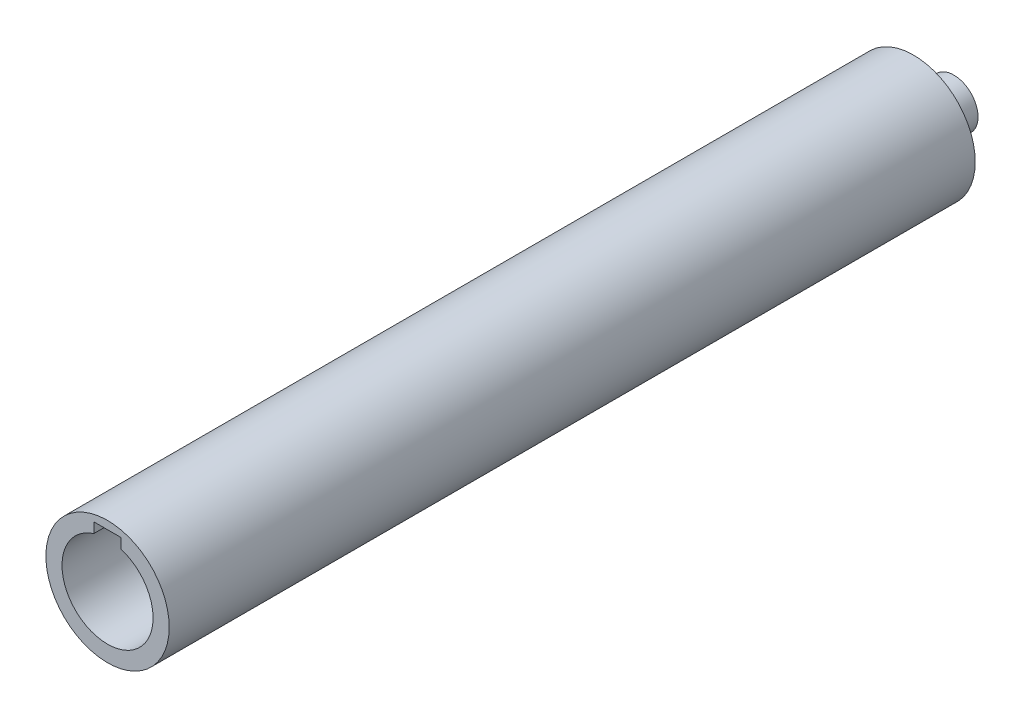
ISO-10303-21;
HEADER;
FILE_DESCRIPTION(('STEP AP214'),'2;1');
FILE_NAME('part.step','',(''),(''),'','','');
FILE_SCHEMA(('AUTOMOTIVE_DESIGN { 1 0 10303 214 1 1 1 1 }'));
ENDSEC;
DATA;
#1=APPLICATION_CONTEXT('core data for automotive mechanical design processes');
#2=APPLICATION_PROTOCOL_DEFINITION('international standard','automotive_design',2000,#1);
#3=PRODUCT_CONTEXT('',#1,'mechanical');
#4=PRODUCT('Part','Part','',(#3));
#5=PRODUCT_RELATED_PRODUCT_CATEGORY('part','',(#4));
#6=PRODUCT_DEFINITION_FORMATION('','',#4);
#7=PRODUCT_DEFINITION_CONTEXT('part definition',#1,'design');
#8=PRODUCT_DEFINITION('design','',#6,#7);
#9=PRODUCT_DEFINITION_SHAPE('','',#8);
#10=(LENGTH_UNIT() NAMED_UNIT(*) SI_UNIT(.MILLI.,.METRE.));
#11=(NAMED_UNIT(*) PLANE_ANGLE_UNIT() SI_UNIT($,.RADIAN.));
#12=(NAMED_UNIT(*) SI_UNIT($,.STERADIAN.) SOLID_ANGLE_UNIT());
#13=UNCERTAINTY_MEASURE_WITH_UNIT(LENGTH_MEASURE(1.E-05),#10,'distance_accuracy_value','');
#14=(GEOMETRIC_REPRESENTATION_CONTEXT(3) GLOBAL_UNCERTAINTY_ASSIGNED_CONTEXT((#13)) GLOBAL_UNIT_ASSIGNED_CONTEXT((#10,
#11,#12)) REPRESENTATION_CONTEXT('',''));
#15=CARTESIAN_POINT('',(0.,0.,0.));
#16=DIRECTION('',(0.,0.,1.));
#17=DIRECTION('',(1.,0.,0.));
#18=AXIS2_PLACEMENT_3D('',#15,#16,#17);
#19=CARTESIAN_POINT('',(0.,0.,-250.));
#20=DIRECTION('',(0.,0.,-1.));
#21=DIRECTION('',(1.,0.,0.));
#22=AXIS2_PLACEMENT_3D('',#19,#20,#21);
#23=PLANE('',#22);
#24=CARTESIAN_POINT('',(0.,0.,-250.));
#25=DIRECTION('',(0.,0.,1.));
#26=DIRECTION('',(1.,0.,0.));
#27=AXIS2_PLACEMENT_3D('',#24,#25,#26);
#28=CIRCLE('',#27,38.25);
#29=CARTESIAN_POINT('',(38.25,0.,-250.));
#30=VERTEX_POINT('',#29);
#31=EDGE_CURVE('E105',#30,#30,#28,.T.);
#32=ORIENTED_EDGE('',*,*,#31,.F.);
#33=EDGE_LOOP('',(#32));
#34=FACE_BOUND('',#33,.T.);
#35=CARTESIAN_POINT('',(0.,0.,-250.));
#36=DIRECTION('',(0.,0.,-1.));
#37=DIRECTION('',(-1.,0.,0.));
#38=AXIS2_PLACEMENT_3D('',#35,#36,#37);
#39=CIRCLE('',#38,15.);
#40=CARTESIAN_POINT('',(-15.,0.,-250.));
#41=VERTEX_POINT('',#40);
#42=EDGE_CURVE('E207',#41,#41,#39,.T.);
#43=ORIENTED_EDGE('',*,*,#42,.F.);
#44=EDGE_LOOP('',(#43));
#45=FACE_BOUND('',#44,.T.);
#46=ADVANCED_FACE('F34',(#34,#45),#23,.T.);
#47=CARTESIAN_POINT('',(0.,0.,250.));
#48=DIRECTION('',(0.,0.,-1.));
#49=DIRECTION('',(-1.,0.,0.));
#50=AXIS2_PLACEMENT_3D('',#47,#48,#49);
#51=CYLINDRICAL_SURFACE('',#50,38.25);
#52=CARTESIAN_POINT('',(0.,0.,250.));
#53=DIRECTION('',(0.,0.,1.));
#54=DIRECTION('',(1.,0.,0.));
#55=AXIS2_PLACEMENT_3D('',#52,#53,#54);
#56=CIRCLE('',#55,38.25);
#57=CARTESIAN_POINT('',(38.25,0.,250.));
#58=VERTEX_POINT('',#57);
#59=EDGE_CURVE('E11',#58,#58,#56,.T.);
#60=ORIENTED_EDGE('',*,*,#59,.F.);
#61=EDGE_LOOP('',(#60));
#62=FACE_BOUND('',#61,.T.);
#63=ORIENTED_EDGE('',*,*,#31,.T.);
#64=EDGE_LOOP('',(#63));
#65=FACE_BOUND('',#64,.T.);
#66=ADVANCED_FACE('F36',(#62,#65),#51,.T.);
#67=CARTESIAN_POINT('',(0.,0.,250.));
#68=DIRECTION('',(0.,0.,1.));
#69=DIRECTION('',(1.,0.,0.));
#70=AXIS2_PLACEMENT_3D('',#67,#68,#69);
#71=PLANE('',#70);
#72=CARTESIAN_POINT('',(0.,0.,250.));
#73=DIRECTION('',(0.,0.,1.));
#74=DIRECTION('',(1.,0.,0.));
#75=AXIS2_PLACEMENT_3D('',#72,#73,#74);
#76=CIRCLE('',#75,28.25);
#77=CARTESIAN_POINT('',(-8.5,26.9409075570961,250.));
#78=VERTEX_POINT('',#77);
#79=CARTESIAN_POINT('',(8.5,26.9409075570961,250.));
#80=VERTEX_POINT('',#79);
#81=EDGE_CURVE('E49',#78,#80,#76,.T.);
#82=ORIENTED_EDGE('',*,*,#81,.F.);
#83=DIRECTION('',(0.,-1.,0.));
#84=VECTOR('',#83,1.);
#85=CARTESIAN_POINT('',(-8.5,26.9409075570961,250.));
#86=LINE('',#85,#84);
#87=CARTESIAN_POINT('',(-8.5,33.25,250.));
#88=VERTEX_POINT('',#87);
#89=EDGE_CURVE('E99',#88,#78,#86,.T.);
#90=ORIENTED_EDGE('',*,*,#89,.F.);
#91=DIRECTION('',(-1.,0.,0.));
#92=VECTOR('',#91,1.);
#93=CARTESIAN_POINT('',(8.5,33.25,250.));
#94=LINE('',#93,#92);
#95=CARTESIAN_POINT('',(8.5,33.25,250.));
#96=VERTEX_POINT('',#95);
#97=EDGE_CURVE('E107',#96,#88,#94,.T.);
#98=ORIENTED_EDGE('',*,*,#97,.F.);
#99=DIRECTION('',(0.,1.,0.));
#100=VECTOR('',#99,1.);
#101=CARTESIAN_POINT('',(8.5,26.9409075570961,250.));
#102=LINE('',#101,#100);
#103=EDGE_CURVE('E83',#80,#96,#102,.T.);
#104=ORIENTED_EDGE('',*,*,#103,.F.);
#105=EDGE_LOOP('',(#82,#90,#98,#104));
#106=FACE_BOUND('',#105,.T.);
#107=ORIENTED_EDGE('',*,*,#59,.T.);
#108=EDGE_LOOP('',(#107));
#109=FACE_BOUND('',#108,.T.);
#110=ADVANCED_FACE('F112',(#106,#109),#71,.T.);
#111=CARTESIAN_POINT('',(0.,0.,200.));
#112=DIRECTION('',(0.,0.,1.));
#113=DIRECTION('',(1.,0.,0.));
#114=AXIS2_PLACEMENT_3D('',#111,#112,#113);
#115=CYLINDRICAL_SURFACE('',#114,28.25);
#116=ORIENTED_EDGE('',*,*,#81,.T.);
#117=DIRECTION('',(0.,0.,1.));
#118=VECTOR('',#117,1.);
#119=CARTESIAN_POINT('',(8.5,26.9409075570961,200.));
#120=LINE('',#119,#118);
#121=CARTESIAN_POINT('',(8.5,26.9409075570961,200.));
#122=VERTEX_POINT('',#121);
#123=EDGE_CURVE('E71',#122,#80,#120,.T.);
#124=ORIENTED_EDGE('',*,*,#123,.F.);
#125=CARTESIAN_POINT('',(0.,0.,200.));
#126=DIRECTION('',(0.,0.,1.));
#127=DIRECTION('',(1.,0.,0.));
#128=AXIS2_PLACEMENT_3D('',#125,#126,#127);
#129=CIRCLE('',#128,28.25);
#130=CARTESIAN_POINT('',(-8.5,26.9409075570961,200.));
#131=VERTEX_POINT('',#130);
#132=EDGE_CURVE('E97',#131,#122,#129,.T.);
#133=ORIENTED_EDGE('',*,*,#132,.F.);
#134=DIRECTION('',(0.,0.,1.));
#135=VECTOR('',#134,1.);
#136=CARTESIAN_POINT('',(-8.5,26.9409075570961,200.));
#137=LINE('',#136,#135);
#138=EDGE_CURVE('E42',#131,#78,#137,.T.);
#139=ORIENTED_EDGE('',*,*,#138,.T.);
#140=EDGE_LOOP('',(#116,#124,#133,#139));
#141=FACE_BOUND('',#140,.T.);
#142=ADVANCED_FACE('F117',(#141),#115,.F.);
#143=CARTESIAN_POINT('',(-8.5,26.9409075570961,200.));
#144=DIRECTION('',(-1.,0.,0.));
#145=DIRECTION('',(0.,-1.,0.));
#146=AXIS2_PLACEMENT_3D('',#143,#144,#145);
#147=PLANE('',#146);
#148=ORIENTED_EDGE('',*,*,#89,.T.);
#149=ORIENTED_EDGE('',*,*,#138,.F.);
#150=DIRECTION('',(0.,-1.,0.));
#151=VECTOR('',#150,1.);
#152=CARTESIAN_POINT('',(-8.5,26.9409075570961,200.));
#153=LINE('',#152,#151);
#154=CARTESIAN_POINT('',(-8.5,33.25,200.));
#155=VERTEX_POINT('',#154);
#156=EDGE_CURVE('E94',#155,#131,#153,.T.);
#157=ORIENTED_EDGE('',*,*,#156,.F.);
#158=DIRECTION('',(0.,0.,1.));
#159=VECTOR('',#158,1.);
#160=CARTESIAN_POINT('',(-8.5,33.25,200.));
#161=LINE('',#160,#159);
#162=EDGE_CURVE('E87',#155,#88,#161,.T.);
#163=ORIENTED_EDGE('',*,*,#162,.T.);
#164=EDGE_LOOP('',(#148,#149,#157,#163));
#165=FACE_BOUND('',#164,.T.);
#166=ADVANCED_FACE('F115',(#165),#147,.F.);
#167=CARTESIAN_POINT('',(8.5,33.25,200.));
#168=DIRECTION('',(0.,1.,0.));
#169=DIRECTION('',(0.,0.,1.));
#170=AXIS2_PLACEMENT_3D('',#167,#168,#169);
#171=PLANE('',#170);
#172=ORIENTED_EDGE('',*,*,#97,.T.);
#173=ORIENTED_EDGE('',*,*,#162,.F.);
#174=DIRECTION('',(-1.,0.,0.));
#175=VECTOR('',#174,1.);
#176=CARTESIAN_POINT('',(8.5,33.25,200.));
#177=LINE('',#176,#175);
#178=CARTESIAN_POINT('',(8.5,33.25,200.));
#179=VERTEX_POINT('',#178);
#180=EDGE_CURVE('E90',#179,#155,#177,.T.);
#181=ORIENTED_EDGE('',*,*,#180,.F.);
#182=DIRECTION('',(0.,0.,1.));
#183=VECTOR('',#182,1.);
#184=CARTESIAN_POINT('',(8.5,33.25,200.));
#185=LINE('',#184,#183);
#186=EDGE_CURVE('E76',#179,#96,#185,.T.);
#187=ORIENTED_EDGE('',*,*,#186,.T.);
#188=EDGE_LOOP('',(#172,#173,#181,#187));
#189=FACE_BOUND('',#188,.T.);
#190=ADVANCED_FACE('F91',(#189),#171,.F.);
#191=CARTESIAN_POINT('',(8.5,26.9409075570961,200.));
#192=DIRECTION('',(1.,0.,0.));
#193=DIRECTION('',(0.,1.,0.));
#194=AXIS2_PLACEMENT_3D('',#191,#192,#193);
#195=PLANE('',#194);
#196=ORIENTED_EDGE('',*,*,#103,.T.);
#197=ORIENTED_EDGE('',*,*,#186,.F.);
#198=DIRECTION('',(0.,1.,0.));
#199=VECTOR('',#198,1.);
#200=CARTESIAN_POINT('',(8.5,26.9409075570961,200.));
#201=LINE('',#200,#199);
#202=EDGE_CURVE('E80',#122,#179,#201,.T.);
#203=ORIENTED_EDGE('',*,*,#202,.F.);
#204=ORIENTED_EDGE('',*,*,#123,.T.);
#205=EDGE_LOOP('',(#196,#197,#203,#204));
#206=FACE_BOUND('',#205,.T.);
#207=ADVANCED_FACE('F78',(#206),#195,.F.);
#208=CARTESIAN_POINT('',(0.,0.,200.));
#209=DIRECTION('',(0.,0.,1.));
#210=DIRECTION('',(1.,0.,0.));
#211=AXIS2_PLACEMENT_3D('',#208,#209,#210);
#212=PLANE('',#211);
#213=ORIENTED_EDGE('',*,*,#132,.T.);
#214=ORIENTED_EDGE('',*,*,#202,.T.);
#215=ORIENTED_EDGE('',*,*,#180,.T.);
#216=ORIENTED_EDGE('',*,*,#156,.T.);
#217=EDGE_LOOP('',(#213,#214,#215,#216));
#218=FACE_BOUND('',#217,.T.);
#219=ADVANCED_FACE('F96',(#218),#212,.T.);
#220=CARTESIAN_POINT('',(0.,0.,-275.));
#221=DIRECTION('',(0.,0.,1.));
#222=DIRECTION('',(1.,0.,0.));
#223=AXIS2_PLACEMENT_3D('',#220,#221,#222);
#224=CYLINDRICAL_SURFACE('',#223,15.);
#225=ORIENTED_EDGE('',*,*,#42,.T.);
#226=EDGE_LOOP('',(#225));
#227=FACE_BOUND('',#226,.T.);
#228=CARTESIAN_POINT('',(0.,0.,-275.));
#229=DIRECTION('',(0.,0.,-1.));
#230=DIRECTION('',(-1.,0.,0.));
#231=AXIS2_PLACEMENT_3D('',#228,#229,#230);
#232=CIRCLE('',#231,15.);
#233=CARTESIAN_POINT('',(-15.,0.,-275.));
#234=VERTEX_POINT('',#233);
#235=EDGE_CURVE('E205',#234,#234,#232,.T.);
#236=ORIENTED_EDGE('',*,*,#235,.F.);
#237=EDGE_LOOP('',(#236));
#238=FACE_BOUND('',#237,.T.);
#239=ADVANCED_FACE('F136',(#227,#238),#224,.T.);
#240=CARTESIAN_POINT('',(0.,0.,-275.));
#241=DIRECTION('',(0.,0.,-1.));
#242=DIRECTION('',(-1.,0.,0.));
#243=AXIS2_PLACEMENT_3D('',#240,#241,#242);
#244=PLANE('',#243);
#245=ORIENTED_EDGE('',*,*,#235,.T.);
#246=EDGE_LOOP('',(#245));
#247=FACE_BOUND('',#246,.T.);
#248=ADVANCED_FACE('F143',(#247),#244,.T.);
#249=CLOSED_SHELL('',(#46,#66,#110,#142,#166,#190,#207,#219,#239,#248));
#250=MANIFOLD_SOLID_BREP('B2',#249);
#251=ADVANCED_BREP_SHAPE_REPRESENTATION('',(#18,#250),#14);
#252=SHAPE_DEFINITION_REPRESENTATION(#9,#251);
ENDSEC;
END-ISO-10303-21;
